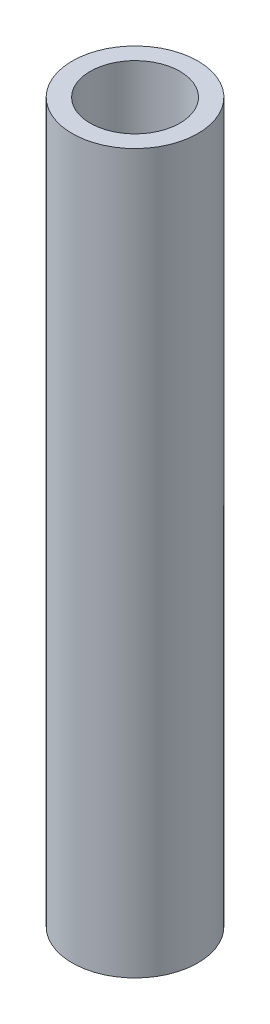
ISO-10303-21;
HEADER;
FILE_DESCRIPTION(('STEP AP214'),'2;1');
FILE_NAME('part.step','',(''),(''),'','','');
FILE_SCHEMA(('AUTOMOTIVE_DESIGN { 1 0 10303 214 1 1 1 1 }'));
ENDSEC;
DATA;
#1=APPLICATION_CONTEXT('core data for automotive mechanical design processes');
#2=APPLICATION_PROTOCOL_DEFINITION('international standard','automotive_design',2000,#1);
#3=PRODUCT_CONTEXT('',#1,'mechanical');
#4=PRODUCT('Part','Part','',(#3));
#5=PRODUCT_RELATED_PRODUCT_CATEGORY('part','',(#4));
#6=PRODUCT_DEFINITION_FORMATION('','',#4);
#7=PRODUCT_DEFINITION_CONTEXT('part definition',#1,'design');
#8=PRODUCT_DEFINITION('design','',#6,#7);
#9=PRODUCT_DEFINITION_SHAPE('','',#8);
#10=(LENGTH_UNIT() NAMED_UNIT(*) SI_UNIT(.MILLI.,.METRE.));
#11=(NAMED_UNIT(*) PLANE_ANGLE_UNIT() SI_UNIT($,.RADIAN.));
#12=(NAMED_UNIT(*) SI_UNIT($,.STERADIAN.) SOLID_ANGLE_UNIT());
#13=UNCERTAINTY_MEASURE_WITH_UNIT(LENGTH_MEASURE(1.E-05),#10,'distance_accuracy_value','');
#14=(GEOMETRIC_REPRESENTATION_CONTEXT(3) GLOBAL_UNCERTAINTY_ASSIGNED_CONTEXT((#13)) GLOBAL_UNIT_ASSIGNED_CONTEXT((#10,
#11,#12)) REPRESENTATION_CONTEXT('',''));
#15=CARTESIAN_POINT('',(0.,0.,0.));
#16=DIRECTION('',(0.,0.,1.));
#17=DIRECTION('',(1.,0.,0.));
#18=AXIS2_PLACEMENT_3D('',#15,#16,#17);
#19=CARTESIAN_POINT('',(0.,152.4,0.));
#20=DIRECTION('',(0.,1.,0.));
#21=DIRECTION('',(0.,0.,1.));
#22=AXIS2_PLACEMENT_3D('',#19,#20,#21);
#23=PLANE('',#22);
#24=CARTESIAN_POINT('',(0.,152.4,0.));
#25=DIRECTION('',(0.,1.,0.));
#26=DIRECTION('',(0.,0.,1.));
#27=AXIS2_PLACEMENT_3D('',#24,#25,#26);
#28=CIRCLE('',#27,13.335);
#29=CARTESIAN_POINT('',(0.,152.4,-13.335));
#30=VERTEX_POINT('',#29);
#31=EDGE_CURVE('E10',#30,#30,#28,.T.);
#32=ORIENTED_EDGE('',*,*,#31,.T.);
#33=EDGE_LOOP('',(#32));
#34=FACE_BOUND('',#33,.T.);
#35=CARTESIAN_POINT('',(0.,152.4,0.));
#36=DIRECTION('',(0.,1.,0.));
#37=DIRECTION('',(0.,0.,1.));
#38=AXIS2_PLACEMENT_3D('',#35,#36,#37);
#39=CIRCLE('',#38,9.525);
#40=CARTESIAN_POINT('',(0.,152.4,-9.525));
#41=VERTEX_POINT('',#40);
#42=EDGE_CURVE('E56',#41,#41,#39,.T.);
#43=ORIENTED_EDGE('',*,*,#42,.F.);
#44=EDGE_LOOP('',(#43));
#45=FACE_BOUND('',#44,.T.);
#46=ADVANCED_FACE('F43',(#34,#45),#23,.T.);
#47=CARTESIAN_POINT('',(0.,0.,0.));
#48=DIRECTION('',(0.,1.,0.));
#49=DIRECTION('',(0.,0.,1.));
#50=AXIS2_PLACEMENT_3D('',#47,#48,#49);
#51=PLANE('',#50);
#52=CARTESIAN_POINT('',(0.,0.,0.));
#53=DIRECTION('',(0.,1.,0.));
#54=DIRECTION('',(0.,0.,1.));
#55=AXIS2_PLACEMENT_3D('',#52,#53,#54);
#56=CIRCLE('',#55,13.335);
#57=CARTESIAN_POINT('',(0.,0.,-13.335));
#58=VERTEX_POINT('',#57);
#59=EDGE_CURVE('E47',#58,#58,#56,.T.);
#60=ORIENTED_EDGE('',*,*,#59,.F.);
#61=EDGE_LOOP('',(#60));
#62=FACE_BOUND('',#61,.T.);
#63=CARTESIAN_POINT('',(0.,0.,0.));
#64=DIRECTION('',(0.,1.,0.));
#65=DIRECTION('',(0.,0.,1.));
#66=AXIS2_PLACEMENT_3D('',#63,#64,#65);
#67=CIRCLE('',#66,9.525);
#68=CARTESIAN_POINT('',(0.,0.,-9.525));
#69=VERTEX_POINT('',#68);
#70=EDGE_CURVE('E58',#69,#69,#67,.T.);
#71=ORIENTED_EDGE('',*,*,#70,.T.);
#72=EDGE_LOOP('',(#71));
#73=FACE_BOUND('',#72,.T.);
#74=ADVANCED_FACE('F70',(#62,#73),#51,.F.);
#75=CARTESIAN_POINT('',(0.,152.4,0.));
#76=DIRECTION('',(0.,-1.,0.));
#77=DIRECTION('',(0.,0.,-1.));
#78=AXIS2_PLACEMENT_3D('',#75,#76,#77);
#79=CYLINDRICAL_SURFACE('',#78,13.335);
#80=CARTESIAN_POINT('',(0.,152.4,-13.335));
#81=CARTESIAN_POINT('',(0.,150.8125,-13.335));
#82=CARTESIAN_POINT('',(0.,149.225,-13.335));
#83=CARTESIAN_POINT('',(0.,146.05,-13.335));
#84=CARTESIAN_POINT('',(0.,144.4625,-13.335));
#85=CARTESIAN_POINT('',(0.,141.2875,-13.335));
#86=CARTESIAN_POINT('',(0.,139.7,-13.335));
#87=CARTESIAN_POINT('',(0.,136.525,-13.335));
#88=CARTESIAN_POINT('',(0.,134.9375,-13.335));
#89=CARTESIAN_POINT('',(0.,131.7625,-13.335));
#90=CARTESIAN_POINT('',(0.,130.175,-13.335));
#91=CARTESIAN_POINT('',(0.,127.,-13.335));
#92=CARTESIAN_POINT('',(0.,125.4125,-13.335));
#93=CARTESIAN_POINT('',(0.,122.2375,-13.335));
#94=CARTESIAN_POINT('',(0.,120.65,-13.335));
#95=CARTESIAN_POINT('',(0.,117.475,-13.335));
#96=CARTESIAN_POINT('',(0.,115.8875,-13.335));
#97=CARTESIAN_POINT('',(0.,112.7125,-13.335));
#98=CARTESIAN_POINT('',(0.,111.125,-13.335));
#99=CARTESIAN_POINT('',(0.,107.95,-13.335));
#100=CARTESIAN_POINT('',(0.,106.3625,-13.335));
#101=CARTESIAN_POINT('',(0.,103.1875,-13.335));
#102=CARTESIAN_POINT('',(0.,101.6,-13.335));
#103=CARTESIAN_POINT('',(0.,98.425,-13.335));
#104=CARTESIAN_POINT('',(0.,96.8375,-13.335));
#105=CARTESIAN_POINT('',(0.,93.6625,-13.335));
#106=CARTESIAN_POINT('',(0.,92.075,-13.335));
#107=CARTESIAN_POINT('',(0.,88.9,-13.335));
#108=CARTESIAN_POINT('',(0.,87.3125,-13.335));
#109=CARTESIAN_POINT('',(0.,84.1375,-13.335));
#110=CARTESIAN_POINT('',(0.,82.55,-13.335));
#111=CARTESIAN_POINT('',(0.,79.375,-13.335));
#112=CARTESIAN_POINT('',(0.,77.7875,-13.335));
#113=CARTESIAN_POINT('',(0.,74.6125,-13.335));
#114=CARTESIAN_POINT('',(0.,73.025,-13.335));
#115=CARTESIAN_POINT('',(0.,69.85,-13.335));
#116=CARTESIAN_POINT('',(0.,68.2625,-13.335));
#117=CARTESIAN_POINT('',(0.,65.0875,-13.335));
#118=CARTESIAN_POINT('',(0.,63.5,-13.335));
#119=CARTESIAN_POINT('',(0.,60.325,-13.335));
#120=CARTESIAN_POINT('',(0.,58.7375,-13.335));
#121=CARTESIAN_POINT('',(0.,55.5625,-13.335));
#122=CARTESIAN_POINT('',(0.,53.975,-13.335));
#123=CARTESIAN_POINT('',(0.,50.8,-13.335));
#124=CARTESIAN_POINT('',(0.,49.2125,-13.335));
#125=CARTESIAN_POINT('',(0.,46.0375,-13.335));
#126=CARTESIAN_POINT('',(0.,44.45,-13.335));
#127=CARTESIAN_POINT('',(0.,41.275,-13.335));
#128=CARTESIAN_POINT('',(0.,39.6875,-13.335));
#129=CARTESIAN_POINT('',(0.,36.5125,-13.335));
#130=CARTESIAN_POINT('',(0.,34.925,-13.335));
#131=CARTESIAN_POINT('',(0.,31.75,-13.335));
#132=CARTESIAN_POINT('',(0.,30.1625,-13.335));
#133=CARTESIAN_POINT('',(0.,26.9875,-13.335));
#134=CARTESIAN_POINT('',(0.,25.4,-13.335));
#135=CARTESIAN_POINT('',(0.,22.225,-13.335));
#136=CARTESIAN_POINT('',(0.,20.6375,-13.335));
#137=CARTESIAN_POINT('',(0.,17.4625,-13.335));
#138=CARTESIAN_POINT('',(0.,15.875,-13.335));
#139=CARTESIAN_POINT('',(0.,12.7,-13.335));
#140=CARTESIAN_POINT('',(0.,11.1125,-13.335));
#141=CARTESIAN_POINT('',(0.,7.93750000000001,-13.335));
#142=CARTESIAN_POINT('',(0.,6.35,-13.335));
#143=CARTESIAN_POINT('',(0.,3.175,-13.335));
#144=CARTESIAN_POINT('',(0.,1.5875,-13.335));
#145=CARTESIAN_POINT('',(0.,0.,-13.335));
#146=B_SPLINE_CURVE_WITH_KNOTS('',3,(#80,#81,#82,#83,#84,#85,#86,#87,#88,#89,#90,#91,#92,#93,
#94,#95,#96,#97,#98,#99,#100,#101,#102,#103,#104,#105,#106,#107,#108,#109,#110,#111,#112,#113,
#114,#115,#116,#117,#118,#119,#120,#121,#122,#123,#124,#125,#126,#127,#128,#129,#130,#131,#132,
#133,#134,#135,#136,#137,#138,#139,#140,#141,#142,#143,#144,#145),.UNSPECIFIED.,.F.,.F.,(4,2,2,
2,2,2,2,2,2,2,2,2,2,2,2,2,2,2,2,2,2,2,2,2,2,2,2,2,2,2,2,2,4),(0.,4.76249999999998,
9.52499999999998,14.2875,19.05,23.8125,28.575,33.3375,38.1,42.8625,47.625,52.3875,57.15,61.9125,
66.675,71.4375,76.2,80.9625,85.725,90.4875,95.25,100.0125,104.775,109.5375,114.3,119.0625,
123.825,128.5875,133.35,138.1125,142.875,147.6375,152.4),.UNSPECIFIED.);
#147=EDGE_CURVE('BSEAM45',#30,#58,#146,.T.);
#148=ORIENTED_EDGE('',*,*,#31,.F.);
#149=ORIENTED_EDGE('',*,*,#59,.T.);
#150=ORIENTED_EDGE('',*,*,#147,.T.);
#151=ORIENTED_EDGE('',*,*,#147,.F.);
#152=EDGE_LOOP('',(#148,#150,#149,#151));
#153=FACE_BOUND('',#152,.T.);
#154=ADVANCED_FACE('F45',(#153),#79,.T.);
#155=CARTESIAN_POINT('',(0.,152.4,0.));
#156=DIRECTION('',(0.,-1.,0.));
#157=DIRECTION('',(0.,0.,-1.));
#158=AXIS2_PLACEMENT_3D('',#155,#156,#157);
#159=CYLINDRICAL_SURFACE('',#158,9.525);
#160=CARTESIAN_POINT('',(0.,152.4,-9.525));
#161=CARTESIAN_POINT('',(0.,150.8125,-9.525));
#162=CARTESIAN_POINT('',(0.,149.225,-9.525));
#163=CARTESIAN_POINT('',(0.,146.05,-9.525));
#164=CARTESIAN_POINT('',(0.,144.4625,-9.525));
#165=CARTESIAN_POINT('',(0.,141.2875,-9.525));
#166=CARTESIAN_POINT('',(0.,139.7,-9.525));
#167=CARTESIAN_POINT('',(0.,136.525,-9.525));
#168=CARTESIAN_POINT('',(0.,134.9375,-9.525));
#169=CARTESIAN_POINT('',(0.,131.7625,-9.525));
#170=CARTESIAN_POINT('',(0.,130.175,-9.525));
#171=CARTESIAN_POINT('',(0.,127.,-9.525));
#172=CARTESIAN_POINT('',(0.,125.4125,-9.525));
#173=CARTESIAN_POINT('',(0.,122.2375,-9.525));
#174=CARTESIAN_POINT('',(0.,120.65,-9.525));
#175=CARTESIAN_POINT('',(0.,117.475,-9.525));
#176=CARTESIAN_POINT('',(0.,115.8875,-9.525));
#177=CARTESIAN_POINT('',(0.,112.7125,-9.525));
#178=CARTESIAN_POINT('',(0.,111.125,-9.525));
#179=CARTESIAN_POINT('',(0.,107.95,-9.525));
#180=CARTESIAN_POINT('',(0.,106.3625,-9.525));
#181=CARTESIAN_POINT('',(0.,103.1875,-9.525));
#182=CARTESIAN_POINT('',(0.,101.6,-9.525));
#183=CARTESIAN_POINT('',(0.,98.425,-9.525));
#184=CARTESIAN_POINT('',(0.,96.8375,-9.525));
#185=CARTESIAN_POINT('',(0.,93.6625,-9.525));
#186=CARTESIAN_POINT('',(0.,92.075,-9.525));
#187=CARTESIAN_POINT('',(0.,88.9,-9.525));
#188=CARTESIAN_POINT('',(0.,87.3125,-9.525));
#189=CARTESIAN_POINT('',(0.,84.1375,-9.525));
#190=CARTESIAN_POINT('',(0.,82.55,-9.525));
#191=CARTESIAN_POINT('',(0.,79.375,-9.525));
#192=CARTESIAN_POINT('',(0.,77.7875,-9.525));
#193=CARTESIAN_POINT('',(0.,74.6125,-9.525));
#194=CARTESIAN_POINT('',(0.,73.025,-9.525));
#195=CARTESIAN_POINT('',(0.,69.85,-9.525));
#196=CARTESIAN_POINT('',(0.,68.2625,-9.525));
#197=CARTESIAN_POINT('',(0.,65.0875,-9.525));
#198=CARTESIAN_POINT('',(0.,63.5,-9.525));
#199=CARTESIAN_POINT('',(0.,60.325,-9.525));
#200=CARTESIAN_POINT('',(0.,58.7375,-9.525));
#201=CARTESIAN_POINT('',(0.,55.5625,-9.525));
#202=CARTESIAN_POINT('',(0.,53.975,-9.525));
#203=CARTESIAN_POINT('',(0.,50.8,-9.525));
#204=CARTESIAN_POINT('',(0.,49.2125,-9.525));
#205=CARTESIAN_POINT('',(0.,46.0375,-9.525));
#206=CARTESIAN_POINT('',(0.,44.45,-9.525));
#207=CARTESIAN_POINT('',(0.,41.275,-9.525));
#208=CARTESIAN_POINT('',(0.,39.6875,-9.525));
#209=CARTESIAN_POINT('',(0.,36.5125,-9.525));
#210=CARTESIAN_POINT('',(0.,34.925,-9.525));
#211=CARTESIAN_POINT('',(0.,31.75,-9.525));
#212=CARTESIAN_POINT('',(0.,30.1625,-9.525));
#213=CARTESIAN_POINT('',(0.,26.9875,-9.525));
#214=CARTESIAN_POINT('',(0.,25.4,-9.525));
#215=CARTESIAN_POINT('',(0.,22.225,-9.525));
#216=CARTESIAN_POINT('',(0.,20.6375,-9.525));
#217=CARTESIAN_POINT('',(0.,17.4625,-9.525));
#218=CARTESIAN_POINT('',(0.,15.875,-9.525));
#219=CARTESIAN_POINT('',(0.,12.7,-9.525));
#220=CARTESIAN_POINT('',(0.,11.1125,-9.525));
#221=CARTESIAN_POINT('',(0.,7.93750000000001,-9.525));
#222=CARTESIAN_POINT('',(0.,6.35,-9.525));
#223=CARTESIAN_POINT('',(0.,3.175,-9.525));
#224=CARTESIAN_POINT('',(0.,1.5875,-9.525));
#225=CARTESIAN_POINT('',(0.,0.,-9.525));
#226=B_SPLINE_CURVE_WITH_KNOTS('',3,(#160,#161,#162,#163,#164,#165,#166,#167,#168,#169,#170,
#171,#172,#173,#174,#175,#176,#177,#178,#179,#180,#181,#182,#183,#184,#185,#186,#187,#188,#189,
#190,#191,#192,#193,#194,#195,#196,#197,#198,#199,#200,#201,#202,#203,#204,#205,#206,#207,#208,
#209,#210,#211,#212,#213,#214,#215,#216,#217,#218,#219,#220,#221,#222,#223,#224,#225),
.UNSPECIFIED.,.F.,.F.,(4,2,2,2,2,2,2,2,2,2,2,2,2,2,2,2,2,2,2,2,2,2,2,2,2,2,2,2,2,2,2,2,4),(0.,
4.7625,9.52500000000001,14.2875,19.05,23.8125,28.575,33.3375,38.1,42.8625,47.625,52.3875,57.15,
61.9125,66.675,71.4375,76.2,80.9625,85.725,90.4875,95.25,100.0125,104.775,109.5375,114.3,
119.0625,123.825,128.5875,133.35,138.1125,142.875,147.6375,152.4),.UNSPECIFIED.);
#227=EDGE_CURVE('BSEAM66',#41,#69,#226,.T.);
#228=ORIENTED_EDGE('',*,*,#42,.T.);
#229=ORIENTED_EDGE('',*,*,#70,.F.);
#230=ORIENTED_EDGE('',*,*,#227,.T.);
#231=ORIENTED_EDGE('',*,*,#227,.F.);
#232=EDGE_LOOP('',(#228,#230,#229,#231));
#233=FACE_BOUND('',#232,.T.);
#234=ADVANCED_FACE('F66',(#233),#159,.F.);
#235=CLOSED_SHELL('',(#46,#74,#154,#234));
#236=MANIFOLD_SOLID_BREP('B2',#235);
#237=ADVANCED_BREP_SHAPE_REPRESENTATION('',(#18,#236),#14);
#238=SHAPE_DEFINITION_REPRESENTATION(#9,#237);
ENDSEC;
END-ISO-10303-21;
